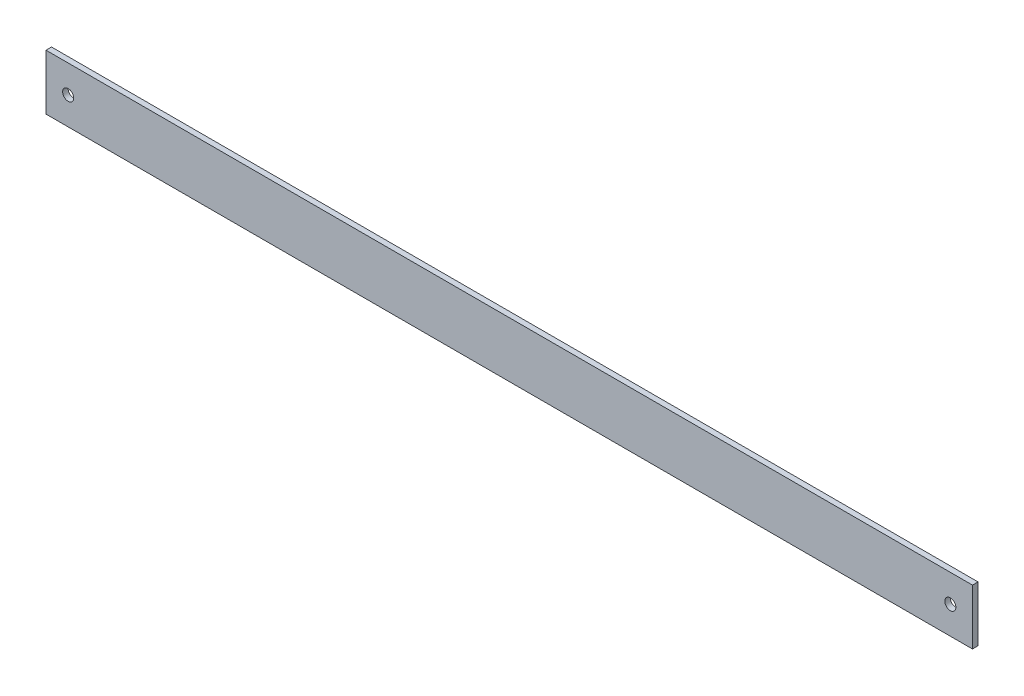
ISO-10303-21;
HEADER;
FILE_DESCRIPTION(('STEP AP214'),'2;1');
FILE_NAME('part.step','',(''),(''),'','','');
FILE_SCHEMA(('AUTOMOTIVE_DESIGN { 1 0 10303 214 1 1 1 1 }'));
ENDSEC;
DATA;
#1=APPLICATION_CONTEXT('core data for automotive mechanical design processes');
#2=APPLICATION_PROTOCOL_DEFINITION('international standard','automotive_design',2000,#1);
#3=PRODUCT_CONTEXT('',#1,'mechanical');
#4=PRODUCT('Part','Part','',(#3));
#5=PRODUCT_RELATED_PRODUCT_CATEGORY('part','',(#4));
#6=PRODUCT_DEFINITION_FORMATION('','',#4);
#7=PRODUCT_DEFINITION_CONTEXT('part definition',#1,'design');
#8=PRODUCT_DEFINITION('design','',#6,#7);
#9=PRODUCT_DEFINITION_SHAPE('','',#8);
#10=(LENGTH_UNIT() NAMED_UNIT(*) SI_UNIT(.MILLI.,.METRE.));
#11=(NAMED_UNIT(*) PLANE_ANGLE_UNIT() SI_UNIT($,.RADIAN.));
#12=(NAMED_UNIT(*) SI_UNIT($,.STERADIAN.) SOLID_ANGLE_UNIT());
#13=UNCERTAINTY_MEASURE_WITH_UNIT(LENGTH_MEASURE(1.E-05),#10,'distance_accuracy_value','');
#14=(GEOMETRIC_REPRESENTATION_CONTEXT(3) GLOBAL_UNCERTAINTY_ASSIGNED_CONTEXT((#13)) GLOBAL_UNIT_ASSIGNED_CONTEXT((#10,
#11,#12)) REPRESENTATION_CONTEXT('',''));
#15=CARTESIAN_POINT('',(0.,0.,0.));
#16=DIRECTION('',(0.,0.,1.));
#17=DIRECTION('',(1.,0.,0.));
#18=AXIS2_PLACEMENT_3D('',#15,#16,#17);
#19=CARTESIAN_POINT('',(-286.909577854999,1668.03196993675,1.5));
#20=DIRECTION('',(1.,0.,0.));
#21=DIRECTION('',(0.,0.,-1.));
#22=AXIS2_PLACEMENT_3D('',#19,#20,#21);
#23=PLANE('',#22);
#24=DIRECTION('',(0.,-1.,0.));
#25=VECTOR('',#24,1.);
#26=CARTESIAN_POINT('',(-286.909577854999,1668.03196993675,0.));
#27=LINE('',#26,#25);
#28=CARTESIAN_POINT('',(-286.909577854999,1683.03196993675,0.));
#29=VERTEX_POINT('',#28);
#30=CARTESIAN_POINT('',(-286.909577854999,1668.03196993675,0.));
#31=VERTEX_POINT('',#30);
#32=EDGE_CURVE('E94',#29,#31,#27,.T.);
#33=ORIENTED_EDGE('',*,*,#32,.T.);
#34=DIRECTION('',(0.,0.,-1.));
#35=VECTOR('',#34,1.);
#36=CARTESIAN_POINT('',(-286.909577854999,1668.03196993675,1.5));
#37=LINE('',#36,#35);
#38=CARTESIAN_POINT('',(-286.909577854999,1668.03196993675,1.5));
#39=VERTEX_POINT('',#38);
#40=EDGE_CURVE('E11',#39,#31,#37,.T.);
#41=ORIENTED_EDGE('',*,*,#40,.F.);
#42=DIRECTION('',(0.,-1.,0.));
#43=VECTOR('',#42,1.);
#44=CARTESIAN_POINT('',(-286.909577854999,1668.03196993675,1.5));
#45=LINE('',#44,#43);
#46=CARTESIAN_POINT('',(-286.909577854999,1683.03196993675,1.5));
#47=VERTEX_POINT('',#46);
#48=EDGE_CURVE('E82',#47,#39,#45,.T.);
#49=ORIENTED_EDGE('',*,*,#48,.F.);
#50=DIRECTION('',(0.,0.,-1.));
#51=VECTOR('',#50,1.);
#52=CARTESIAN_POINT('',(-286.909577854999,1683.03196993675,1.5));
#53=LINE('',#52,#51);
#54=EDGE_CURVE('E90',#47,#29,#53,.T.);
#55=ORIENTED_EDGE('',*,*,#54,.T.);
#56=EDGE_LOOP('',(#33,#41,#49,#55));
#57=FACE_BOUND('',#56,.T.);
#58=ADVANCED_FACE('F31',(#57),#23,.F.);
#59=CARTESIAN_POINT('',(-286.909577854999,1668.03196993675,1.5));
#60=DIRECTION('',(0.,1.,0.));
#61=DIRECTION('',(0.,0.,1.));
#62=AXIS2_PLACEMENT_3D('',#59,#60,#61);
#63=PLANE('',#62);
#64=DIRECTION('',(1.,0.,0.));
#65=VECTOR('',#64,1.);
#66=CARTESIAN_POINT('',(-286.909577854999,1668.03196993675,0.));
#67=LINE('',#66,#65);
#68=CARTESIAN_POINT('',(-35.909577854999,1668.03196993675,0.));
#69=VERTEX_POINT('',#68);
#70=EDGE_CURVE('E86',#31,#69,#67,.T.);
#71=ORIENTED_EDGE('',*,*,#70,.T.);
#72=DIRECTION('',(0.,0.,-1.));
#73=VECTOR('',#72,1.);
#74=CARTESIAN_POINT('',(-35.909577854999,1668.03196993675,1.5));
#75=LINE('',#74,#73);
#76=CARTESIAN_POINT('',(-35.909577854999,1668.03196993675,1.5));
#77=VERTEX_POINT('',#76);
#78=EDGE_CURVE('E39',#77,#69,#75,.T.);
#79=ORIENTED_EDGE('',*,*,#78,.F.);
#80=DIRECTION('',(1.,0.,0.));
#81=VECTOR('',#80,1.);
#82=CARTESIAN_POINT('',(-286.909577854999,1668.03196993675,1.5));
#83=LINE('',#82,#81);
#84=EDGE_CURVE('E77',#39,#77,#83,.T.);
#85=ORIENTED_EDGE('',*,*,#84,.F.);
#86=ORIENTED_EDGE('',*,*,#40,.T.);
#87=EDGE_LOOP('',(#71,#79,#85,#86));
#88=FACE_BOUND('',#87,.T.);
#89=ADVANCED_FACE('F85',(#88),#63,.F.);
#90=CARTESIAN_POINT('',(-35.909577854999,1668.03196993675,1.5));
#91=DIRECTION('',(-1.,0.,0.));
#92=DIRECTION('',(0.,0.,1.));
#93=AXIS2_PLACEMENT_3D('',#90,#91,#92);
#94=PLANE('',#93);
#95=DIRECTION('',(0.,1.,0.));
#96=VECTOR('',#95,1.);
#97=CARTESIAN_POINT('',(-35.909577854999,1668.03196993675,0.));
#98=LINE('',#97,#96);
#99=CARTESIAN_POINT('',(-35.909577854999,1683.03196993675,0.));
#100=VERTEX_POINT('',#99);
#101=EDGE_CURVE('E64',#69,#100,#98,.T.);
#102=ORIENTED_EDGE('',*,*,#101,.T.);
#103=DIRECTION('',(0.,0.,-1.));
#104=VECTOR('',#103,1.);
#105=CARTESIAN_POINT('',(-35.909577854999,1683.03196993675,1.5));
#106=LINE('',#105,#104);
#107=CARTESIAN_POINT('',(-35.909577854999,1683.03196993675,1.5));
#108=VERTEX_POINT('',#107);
#109=EDGE_CURVE('E87',#108,#100,#106,.T.);
#110=ORIENTED_EDGE('',*,*,#109,.F.);
#111=DIRECTION('',(0.,1.,0.));
#112=VECTOR('',#111,1.);
#113=CARTESIAN_POINT('',(-35.909577854999,1668.03196993675,1.5));
#114=LINE('',#113,#112);
#115=EDGE_CURVE('E80',#77,#108,#114,.T.);
#116=ORIENTED_EDGE('',*,*,#115,.F.);
#117=ORIENTED_EDGE('',*,*,#78,.T.);
#118=EDGE_LOOP('',(#102,#110,#116,#117));
#119=FACE_BOUND('',#118,.T.);
#120=ADVANCED_FACE('F88',(#119),#94,.F.);
#121=CARTESIAN_POINT('',(-286.909577854999,1683.03196993675,1.5));
#122=DIRECTION('',(0.,-1.,0.));
#123=DIRECTION('',(0.,0.,-1.));
#124=AXIS2_PLACEMENT_3D('',#121,#122,#123);
#125=PLANE('',#124);
#126=DIRECTION('',(-1.,0.,0.));
#127=VECTOR('',#126,1.);
#128=CARTESIAN_POINT('',(-286.909577854999,1683.03196993675,0.));
#129=LINE('',#128,#127);
#130=EDGE_CURVE('E70',#100,#29,#129,.T.);
#131=ORIENTED_EDGE('',*,*,#130,.T.);
#132=ORIENTED_EDGE('',*,*,#54,.F.);
#133=DIRECTION('',(-1.,0.,0.));
#134=VECTOR('',#133,1.);
#135=CARTESIAN_POINT('',(-286.909577854999,1683.03196993675,1.5));
#136=LINE('',#135,#134);
#137=EDGE_CURVE('E47',#108,#47,#136,.T.);
#138=ORIENTED_EDGE('',*,*,#137,.F.);
#139=ORIENTED_EDGE('',*,*,#109,.T.);
#140=EDGE_LOOP('',(#131,#132,#138,#139));
#141=FACE_BOUND('',#140,.T.);
#142=ADVANCED_FACE('F102',(#141),#125,.F.);
#143=CARTESIAN_POINT('',(-286.909577854999,1683.03196993675,1.5));
#144=DIRECTION('',(0.,0.,-1.));
#145=DIRECTION('',(-1.,0.,0.));
#146=AXIS2_PLACEMENT_3D('',#143,#144,#145);
#147=PLANE('',#146);
#148=CARTESIAN_POINT('',(-41.909577854999,1675.53196993675,1.5));
#149=DIRECTION('',(0.,0.,-1.));
#150=DIRECTION('',(-1.,0.,0.));
#151=AXIS2_PLACEMENT_3D('',#148,#149,#150);
#152=CIRCLE('',#151,1.49999999999971);
#153=CARTESIAN_POINT('',(-43.4095778549987,1675.53196993675,1.5));
#154=VERTEX_POINT('',#153);
#155=EDGE_CURVE('E111',#154,#154,#152,.T.);
#156=ORIENTED_EDGE('',*,*,#155,.T.);
#157=EDGE_LOOP('',(#156));
#158=FACE_BOUND('',#157,.T.);
#159=CARTESIAN_POINT('',(-280.909577854999,1675.53196993675,1.5));
#160=DIRECTION('',(0.,0.,-1.));
#161=DIRECTION('',(-1.,0.,0.));
#162=AXIS2_PLACEMENT_3D('',#159,#160,#161);
#163=CIRCLE('',#162,1.49999999999999);
#164=CARTESIAN_POINT('',(-282.409577854999,1675.53196993675,1.5));
#165=VERTEX_POINT('',#164);
#166=EDGE_CURVE('E97',#165,#165,#163,.T.);
#167=ORIENTED_EDGE('',*,*,#166,.T.);
#168=EDGE_LOOP('',(#167));
#169=FACE_BOUND('',#168,.T.);
#170=ORIENTED_EDGE('',*,*,#48,.T.);
#171=ORIENTED_EDGE('',*,*,#84,.T.);
#172=ORIENTED_EDGE('',*,*,#115,.T.);
#173=ORIENTED_EDGE('',*,*,#137,.T.);
#174=EDGE_LOOP('',(#170,#171,#172,#173));
#175=FACE_BOUND('',#174,.T.);
#176=ADVANCED_FACE('F78',(#158,#169,#175),#147,.F.);
#177=CARTESIAN_POINT('',(-286.909577854999,1683.03196993675,0.));
#178=DIRECTION('',(0.,0.,-1.));
#179=DIRECTION('',(-1.,0.,0.));
#180=AXIS2_PLACEMENT_3D('',#177,#178,#179);
#181=PLANE('',#180);
#182=CARTESIAN_POINT('',(-41.909577854999,1675.53196993675,0.));
#183=DIRECTION('',(0.,0.,-1.));
#184=DIRECTION('',(-1.,0.,0.));
#185=AXIS2_PLACEMENT_3D('',#182,#183,#184);
#186=CIRCLE('',#185,1.49999999999971);
#187=CARTESIAN_POINT('',(-43.4095778549987,1675.53196993675,0.));
#188=VERTEX_POINT('',#187);
#189=EDGE_CURVE('E114',#188,#188,#186,.T.);
#190=ORIENTED_EDGE('',*,*,#189,.F.);
#191=EDGE_LOOP('',(#190));
#192=FACE_BOUND('',#191,.T.);
#193=CARTESIAN_POINT('',(-280.909577854999,1675.53196993675,0.));
#194=DIRECTION('',(0.,0.,-1.));
#195=DIRECTION('',(-1.,0.,0.));
#196=AXIS2_PLACEMENT_3D('',#193,#194,#195);
#197=CIRCLE('',#196,1.49999999999999);
#198=CARTESIAN_POINT('',(-282.409577854999,1675.53196993675,0.));
#199=VERTEX_POINT('',#198);
#200=EDGE_CURVE('E108',#199,#199,#197,.T.);
#201=ORIENTED_EDGE('',*,*,#200,.F.);
#202=EDGE_LOOP('',(#201));
#203=FACE_BOUND('',#202,.T.);
#204=ORIENTED_EDGE('',*,*,#32,.F.);
#205=ORIENTED_EDGE('',*,*,#130,.F.);
#206=ORIENTED_EDGE('',*,*,#101,.F.);
#207=ORIENTED_EDGE('',*,*,#70,.F.);
#208=EDGE_LOOP('',(#204,#205,#206,#207));
#209=FACE_BOUND('',#208,.T.);
#210=ADVANCED_FACE('F105',(#192,#203,#209),#181,.T.);
#211=CARTESIAN_POINT('',(-280.909577854999,1675.53196993675,1.5));
#212=DIRECTION('',(0.,0.,-1.));
#213=DIRECTION('',(-1.,0.,0.));
#214=AXIS2_PLACEMENT_3D('',#211,#212,#213);
#215=CYLINDRICAL_SURFACE('',#214,1.49999999999999);
#216=ORIENTED_EDGE('',*,*,#166,.F.);
#217=EDGE_LOOP('',(#216));
#218=FACE_BOUND('',#217,.T.);
#219=ORIENTED_EDGE('',*,*,#200,.T.);
#220=EDGE_LOOP('',(#219));
#221=FACE_BOUND('',#220,.T.);
#222=ADVANCED_FACE('F125',(#218,#221),#215,.F.);
#223=CARTESIAN_POINT('',(-41.909577854999,1675.53196993675,1.5));
#224=DIRECTION('',(0.,0.,-1.));
#225=DIRECTION('',(-1.,0.,0.));
#226=AXIS2_PLACEMENT_3D('',#223,#224,#225);
#227=CYLINDRICAL_SURFACE('',#226,1.49999999999971);
#228=ORIENTED_EDGE('',*,*,#155,.F.);
#229=EDGE_LOOP('',(#228));
#230=FACE_BOUND('',#229,.T.);
#231=ORIENTED_EDGE('',*,*,#189,.T.);
#232=EDGE_LOOP('',(#231));
#233=FACE_BOUND('',#232,.T.);
#234=ADVANCED_FACE('F122',(#230,#233),#227,.F.);
#235=CLOSED_SHELL('',(#58,#89,#120,#142,#176,#210,#222,#234));
#236=MANIFOLD_SOLID_BREP('B2',#235);
#237=ADVANCED_BREP_SHAPE_REPRESENTATION('',(#18,#236),#14);
#238=SHAPE_DEFINITION_REPRESENTATION(#9,#237);
ENDSEC;
END-ISO-10303-21;
